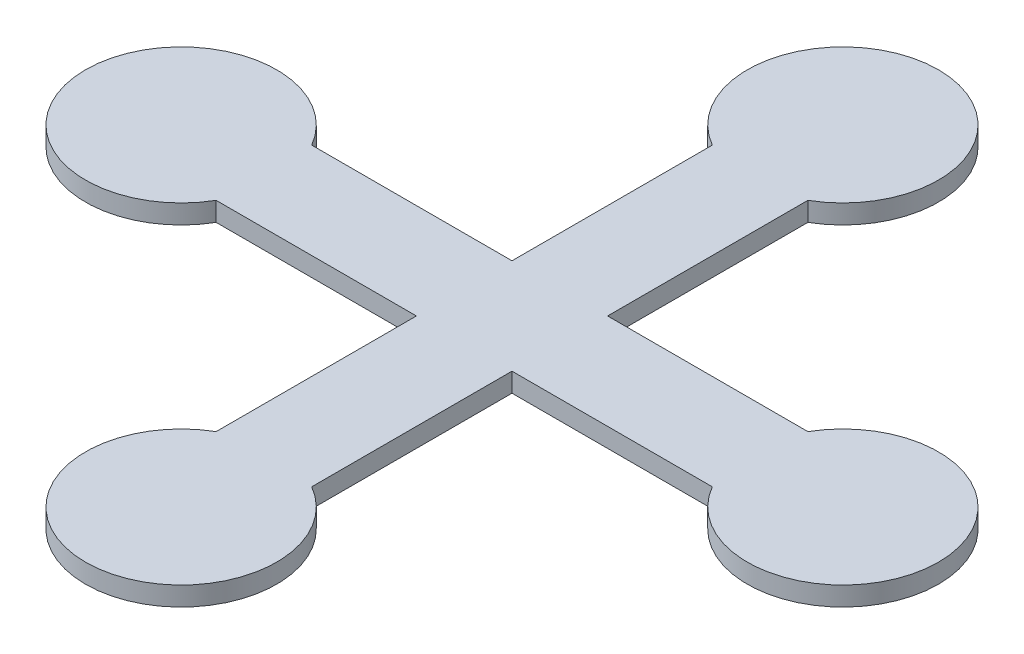
ISO-10303-21;
HEADER;
FILE_DESCRIPTION(('STEP AP214'),'2;1');
FILE_NAME('part.step','',(''),(''),'','','');
FILE_SCHEMA(('AUTOMOTIVE_DESIGN { 1 0 10303 214 1 1 1 1 }'));
ENDSEC;
DATA;
#1=APPLICATION_CONTEXT('core data for automotive mechanical design processes');
#2=APPLICATION_PROTOCOL_DEFINITION('international standard','automotive_design',2000,#1);
#3=PRODUCT_CONTEXT('',#1,'mechanical');
#4=PRODUCT('Part','Part','',(#3));
#5=PRODUCT_RELATED_PRODUCT_CATEGORY('part','',(#4));
#6=PRODUCT_DEFINITION_FORMATION('','',#4);
#7=PRODUCT_DEFINITION_CONTEXT('part definition',#1,'design');
#8=PRODUCT_DEFINITION('design','',#6,#7);
#9=PRODUCT_DEFINITION_SHAPE('','',#8);
#10=(LENGTH_UNIT() NAMED_UNIT(*) SI_UNIT(.MILLI.,.METRE.));
#11=(NAMED_UNIT(*) PLANE_ANGLE_UNIT() SI_UNIT($,.RADIAN.));
#12=(NAMED_UNIT(*) SI_UNIT($,.STERADIAN.) SOLID_ANGLE_UNIT());
#13=UNCERTAINTY_MEASURE_WITH_UNIT(LENGTH_MEASURE(1.E-05),#10,'distance_accuracy_value','');
#14=(GEOMETRIC_REPRESENTATION_CONTEXT(3) GLOBAL_UNCERTAINTY_ASSIGNED_CONTEXT((#13)) GLOBAL_UNIT_ASSIGNED_CONTEXT((#10,
#11,#12)) REPRESENTATION_CONTEXT('',''));
#15=CARTESIAN_POINT('',(0.,0.,0.));
#16=DIRECTION('',(0.,0.,1.));
#17=DIRECTION('',(1.,0.,0.));
#18=AXIS2_PLACEMENT_3D('',#15,#16,#17);
#19=CARTESIAN_POINT('',(0.124999999999999,0.05,0.125));
#20=DIRECTION('',(-1.,0.,0.));
#21=DIRECTION('',(0.,0.,1.));
#22=AXIS2_PLACEMENT_3D('',#19,#20,#21);
#23=PLANE('',#22);
#24=DIRECTION('',(0.,0.,-1.));
#25=VECTOR('',#24,1.);
#26=CARTESIAN_POINT('',(0.124999999999999,0.,0.125));
#27=LINE('',#26,#25);
#28=CARTESIAN_POINT('',(0.124999999999995,0.,0.648770499799574));
#29=VERTEX_POINT('',#28);
#30=CARTESIAN_POINT('',(0.124999999999999,0.,0.125));
#31=VERTEX_POINT('',#30);
#32=EDGE_CURVE('E164',#29,#31,#27,.T.);
#33=ORIENTED_EDGE('',*,*,#32,.T.);
#34=DIRECTION('',(0.,-1.,0.));
#35=VECTOR('',#34,1.);
#36=CARTESIAN_POINT('',(0.124999999999999,0.05,0.125));
#37=LINE('',#36,#35);
#38=CARTESIAN_POINT('',(0.124999999999999,0.05,0.125));
#39=VERTEX_POINT('',#38);
#40=EDGE_CURVE('E11',#39,#31,#37,.T.);
#41=ORIENTED_EDGE('',*,*,#40,.F.);
#42=DIRECTION('',(0.,0.,-1.));
#43=VECTOR('',#42,1.);
#44=CARTESIAN_POINT('',(0.124999999999999,0.05,0.125));
#45=LINE('',#44,#43);
#46=CARTESIAN_POINT('',(0.124999999999995,0.05,0.648770499799574));
#47=VERTEX_POINT('',#46);
#48=EDGE_CURVE('E198',#47,#39,#45,.T.);
#49=ORIENTED_EDGE('',*,*,#48,.F.);
#50=DIRECTION('',(0.,-1.,0.));
#51=VECTOR('',#50,1.);
#52=CARTESIAN_POINT('',(0.124999999999995,0.05,0.648770499799574));
#53=LINE('',#52,#51);
#54=EDGE_CURVE('E160',#47,#29,#53,.T.);
#55=ORIENTED_EDGE('',*,*,#54,.T.);
#56=EDGE_LOOP('',(#33,#41,#49,#55));
#57=FACE_BOUND('',#56,.T.);
#58=ADVANCED_FACE('F39',(#57),#23,.F.);
#59=CARTESIAN_POINT('',(0.124999999999999,0.05,0.125));
#60=DIRECTION('',(0.,0.,-1.));
#61=DIRECTION('',(-1.,0.,0.));
#62=AXIS2_PLACEMENT_3D('',#59,#60,#61);
#63=PLANE('',#62);
#64=DIRECTION('',(1.,0.,0.));
#65=VECTOR('',#64,1.);
#66=CARTESIAN_POINT('',(0.124999999999999,0.,0.125));
#67=LINE('',#66,#65);
#68=CARTESIAN_POINT('',(0.648770499799573,0.,0.125000000000002));
#69=VERTEX_POINT('',#68);
#70=EDGE_CURVE('E168',#31,#69,#67,.T.);
#71=ORIENTED_EDGE('',*,*,#70,.T.);
#72=DIRECTION('',(0.,-1.,0.));
#73=VECTOR('',#72,1.);
#74=CARTESIAN_POINT('',(0.648770499799573,0.05,0.125000000000002));
#75=LINE('',#74,#73);
#76=CARTESIAN_POINT('',(0.648770499799573,0.05,0.125000000000002));
#77=VERTEX_POINT('',#76);
#78=EDGE_CURVE('E48',#77,#69,#75,.T.);
#79=ORIENTED_EDGE('',*,*,#78,.F.);
#80=DIRECTION('',(1.,0.,0.));
#81=VECTOR('',#80,1.);
#82=CARTESIAN_POINT('',(0.124999999999999,0.05,0.125));
#83=LINE('',#82,#81);
#84=EDGE_CURVE('E111',#39,#77,#83,.T.);
#85=ORIENTED_EDGE('',*,*,#84,.F.);
#86=ORIENTED_EDGE('',*,*,#40,.T.);
#87=EDGE_LOOP('',(#71,#79,#85,#86));
#88=FACE_BOUND('',#87,.T.);
#89=ADVANCED_FACE('F292',(#88),#63,.F.);
#90=CARTESIAN_POINT('',(0.865276850745683,0.05,0.));
#91=DIRECTION('',(0.,-1.,0.));
#92=DIRECTION('',(0.,0.,-1.));
#93=AXIS2_PLACEMENT_3D('',#90,#91,#92);
#94=CYLINDRICAL_SURFACE('',#93,0.25);
#95=CARTESIAN_POINT('',(0.865276850745683,0.,0.));
#96=DIRECTION('',(0.,1.,0.));
#97=DIRECTION('',(0.,0.,1.));
#98=AXIS2_PLACEMENT_3D('',#95,#96,#97);
#99=CIRCLE('',#98,0.25);
#100=CARTESIAN_POINT('',(0.648770499799574,0.,-0.124999999999998));
#101=VERTEX_POINT('',#100);
#102=EDGE_CURVE('E171',#69,#101,#99,.T.);
#103=ORIENTED_EDGE('',*,*,#102,.T.);
#104=DIRECTION('',(0.,-1.,0.));
#105=VECTOR('',#104,1.);
#106=CARTESIAN_POINT('',(0.648770499799574,0.05,-0.124999999999998));
#107=LINE('',#106,#105);
#108=CARTESIAN_POINT('',(0.648770499799574,0.05,-0.124999999999998));
#109=VERTEX_POINT('',#108);
#110=EDGE_CURVE('E225',#109,#101,#107,.T.);
#111=ORIENTED_EDGE('',*,*,#110,.F.);
#112=CARTESIAN_POINT('',(0.865276850745683,0.05,0.));
#113=DIRECTION('',(0.,1.,0.));
#114=DIRECTION('',(0.,0.,1.));
#115=AXIS2_PLACEMENT_3D('',#112,#113,#114);
#116=CIRCLE('',#115,0.25);
#117=EDGE_CURVE('E235',#77,#109,#116,.T.);
#118=ORIENTED_EDGE('',*,*,#117,.F.);
#119=ORIENTED_EDGE('',*,*,#78,.T.);
#120=EDGE_LOOP('',(#103,#111,#118,#119));
#121=FACE_BOUND('',#120,.T.);
#122=ADVANCED_FACE('F233',(#121),#94,.T.);
#123=CARTESIAN_POINT('',(0.125,0.05,-0.124999999999999));
#124=DIRECTION('',(0.,0.,1.));
#125=DIRECTION('',(1.,0.,0.));
#126=AXIS2_PLACEMENT_3D('',#123,#124,#125);
#127=PLANE('',#126);
#128=DIRECTION('',(-1.,0.,0.));
#129=VECTOR('',#128,1.);
#130=CARTESIAN_POINT('',(0.125,0.,-0.124999999999999));
#131=LINE('',#130,#129);
#132=CARTESIAN_POINT('',(0.125,0.,-0.124999999999999));
#133=VERTEX_POINT('',#132);
#134=EDGE_CURVE('E174',#101,#133,#131,.T.);
#135=ORIENTED_EDGE('',*,*,#134,.T.);
#136=DIRECTION('',(0.,-1.,0.));
#137=VECTOR('',#136,1.);
#138=CARTESIAN_POINT('',(0.125,0.05,-0.124999999999999));
#139=LINE('',#138,#137);
#140=CARTESIAN_POINT('',(0.125,0.05,-0.124999999999999));
#141=VERTEX_POINT('',#140);
#142=EDGE_CURVE('E221',#141,#133,#139,.T.);
#143=ORIENTED_EDGE('',*,*,#142,.F.);
#144=DIRECTION('',(-1.,0.,0.));
#145=VECTOR('',#144,1.);
#146=CARTESIAN_POINT('',(0.125,0.05,-0.124999999999999));
#147=LINE('',#146,#145);
#148=EDGE_CURVE('E254',#109,#141,#147,.T.);
#149=ORIENTED_EDGE('',*,*,#148,.F.);
#150=ORIENTED_EDGE('',*,*,#110,.T.);
#151=EDGE_LOOP('',(#135,#143,#149,#150));
#152=FACE_BOUND('',#151,.T.);
#153=ADVANCED_FACE('F244',(#152),#127,.F.);
#154=CARTESIAN_POINT('',(0.125,0.05,-0.124999999999999));
#155=DIRECTION('',(-1.,0.,0.));
#156=DIRECTION('',(0.,0.,1.));
#157=AXIS2_PLACEMENT_3D('',#154,#155,#156);
#158=PLANE('',#157);
#159=DIRECTION('',(0.,0.,-1.));
#160=VECTOR('',#159,1.);
#161=CARTESIAN_POINT('',(0.125,0.,-0.124999999999999));
#162=LINE('',#161,#160);
#163=CARTESIAN_POINT('',(0.125,0.,-0.648770499799574));
#164=VERTEX_POINT('',#163);
#165=EDGE_CURVE('E177',#133,#164,#162,.T.);
#166=ORIENTED_EDGE('',*,*,#165,.T.);
#167=DIRECTION('',(0.,-1.,0.));
#168=VECTOR('',#167,1.);
#169=CARTESIAN_POINT('',(0.125,0.05,-0.648770499799574));
#170=LINE('',#169,#168);
#171=CARTESIAN_POINT('',(0.125,0.05,-0.648770499799574));
#172=VERTEX_POINT('',#171);
#173=EDGE_CURVE('E217',#172,#164,#170,.T.);
#174=ORIENTED_EDGE('',*,*,#173,.F.);
#175=DIRECTION('',(0.,0.,-1.));
#176=VECTOR('',#175,1.);
#177=CARTESIAN_POINT('',(0.125,0.05,-0.124999999999999));
#178=LINE('',#177,#176);
#179=EDGE_CURVE('E250',#141,#172,#178,.T.);
#180=ORIENTED_EDGE('',*,*,#179,.F.);
#181=ORIENTED_EDGE('',*,*,#142,.T.);
#182=EDGE_LOOP('',(#166,#174,#180,#181));
#183=FACE_BOUND('',#182,.T.);
#184=ADVANCED_FACE('F248',(#183),#158,.F.);
#185=CARTESIAN_POINT('',(0.,0.05,-0.865276850745683));
#186=DIRECTION('',(0.,-1.,0.));
#187=DIRECTION('',(0.,0.,-1.));
#188=AXIS2_PLACEMENT_3D('',#185,#186,#187);
#189=CYLINDRICAL_SURFACE('',#188,0.25);
#190=CARTESIAN_POINT('',(0.,0.,-0.865276850745683));
#191=DIRECTION('',(0.,1.,0.));
#192=DIRECTION('',(0.,0.,1.));
#193=AXIS2_PLACEMENT_3D('',#190,#191,#192);
#194=CIRCLE('',#193,0.25);
#195=CARTESIAN_POINT('',(-0.125,0.,-0.648770499799574));
#196=VERTEX_POINT('',#195);
#197=EDGE_CURVE('E180',#164,#196,#194,.T.);
#198=ORIENTED_EDGE('',*,*,#197,.T.);
#199=DIRECTION('',(0.,-1.,0.));
#200=VECTOR('',#199,1.);
#201=CARTESIAN_POINT('',(-0.125,0.05,-0.648770499799574));
#202=LINE('',#201,#200);
#203=CARTESIAN_POINT('',(-0.125,0.05,-0.648770499799574));
#204=VERTEX_POINT('',#203);
#205=EDGE_CURVE('E213',#204,#196,#202,.T.);
#206=ORIENTED_EDGE('',*,*,#205,.F.);
#207=CARTESIAN_POINT('',(0.,0.05,-0.865276850745683));
#208=DIRECTION('',(0.,1.,0.));
#209=DIRECTION('',(0.,0.,1.));
#210=AXIS2_PLACEMENT_3D('',#207,#208,#209);
#211=CIRCLE('',#210,0.25);
#212=EDGE_CURVE('E253',#172,#204,#211,.T.);
#213=ORIENTED_EDGE('',*,*,#212,.F.);
#214=ORIENTED_EDGE('',*,*,#173,.T.);
#215=EDGE_LOOP('',(#198,#206,#213,#214));
#216=FACE_BOUND('',#215,.T.);
#217=ADVANCED_FACE('F305',(#216),#189,.T.);
#218=CARTESIAN_POINT('',(-0.125,0.05,-0.125000000000001));
#219=DIRECTION('',(1.,0.,0.));
#220=DIRECTION('',(0.,0.,-1.));
#221=AXIS2_PLACEMENT_3D('',#218,#219,#220);
#222=PLANE('',#221);
#223=DIRECTION('',(0.,0.,1.));
#224=VECTOR('',#223,1.);
#225=CARTESIAN_POINT('',(-0.125,0.,-0.125000000000001));
#226=LINE('',#225,#224);
#227=CARTESIAN_POINT('',(-0.125,0.,-0.125000000000001));
#228=VERTEX_POINT('',#227);
#229=EDGE_CURVE('E183',#196,#228,#226,.T.);
#230=ORIENTED_EDGE('',*,*,#229,.T.);
#231=DIRECTION('',(0.,-1.,0.));
#232=VECTOR('',#231,1.);
#233=CARTESIAN_POINT('',(-0.125,0.05,-0.125000000000001));
#234=LINE('',#233,#232);
#235=CARTESIAN_POINT('',(-0.125,0.05,-0.125000000000001));
#236=VERTEX_POINT('',#235);
#237=EDGE_CURVE('E209',#236,#228,#234,.T.);
#238=ORIENTED_EDGE('',*,*,#237,.F.);
#239=DIRECTION('',(0.,0.,1.));
#240=VECTOR('',#239,1.);
#241=CARTESIAN_POINT('',(-0.125,0.05,-0.125000000000001));
#242=LINE('',#241,#240);
#243=EDGE_CURVE('E258',#204,#236,#242,.T.);
#244=ORIENTED_EDGE('',*,*,#243,.F.);
#245=ORIENTED_EDGE('',*,*,#205,.T.);
#246=EDGE_LOOP('',(#230,#238,#244,#245));
#247=FACE_BOUND('',#246,.T.);
#248=ADVANCED_FACE('F308',(#247),#222,.F.);
#249=CARTESIAN_POINT('',(-0.125,0.05,-0.125000000000001));
#250=DIRECTION('',(0.,0.,1.));
#251=DIRECTION('',(1.,0.,0.));
#252=AXIS2_PLACEMENT_3D('',#249,#250,#251);
#253=PLANE('',#252);
#254=DIRECTION('',(-1.,0.,0.));
#255=VECTOR('',#254,1.);
#256=CARTESIAN_POINT('',(-0.125,0.,-0.125000000000001));
#257=LINE('',#256,#255);
#258=CARTESIAN_POINT('',(-0.648770499799572,0.,-0.125000000000007));
#259=VERTEX_POINT('',#258);
#260=EDGE_CURVE('E186',#228,#259,#257,.T.);
#261=ORIENTED_EDGE('',*,*,#260,.T.);
#262=DIRECTION('',(0.,-1.,0.));
#263=VECTOR('',#262,1.);
#264=CARTESIAN_POINT('',(-0.648770499799572,0.05,-0.125000000000007));
#265=LINE('',#264,#263);
#266=CARTESIAN_POINT('',(-0.648770499799572,0.05,-0.125000000000007));
#267=VERTEX_POINT('',#266);
#268=EDGE_CURVE('E205',#267,#259,#265,.T.);
#269=ORIENTED_EDGE('',*,*,#268,.F.);
#270=DIRECTION('',(-1.,0.,0.));
#271=VECTOR('',#270,1.);
#272=CARTESIAN_POINT('',(-0.125,0.05,-0.125000000000001));
#273=LINE('',#272,#271);
#274=EDGE_CURVE('E265',#236,#267,#273,.T.);
#275=ORIENTED_EDGE('',*,*,#274,.F.);
#276=ORIENTED_EDGE('',*,*,#237,.T.);
#277=EDGE_LOOP('',(#261,#269,#275,#276));
#278=FACE_BOUND('',#277,.T.);
#279=ADVANCED_FACE('F273',(#278),#253,.F.);
#280=CARTESIAN_POINT('',(-0.865276850745683,0.05,0.));
#281=DIRECTION('',(0.,-1.,0.));
#282=DIRECTION('',(0.,0.,-1.));
#283=AXIS2_PLACEMENT_3D('',#280,#281,#282);
#284=CYLINDRICAL_SURFACE('',#283,0.25);
#285=CARTESIAN_POINT('',(-0.865276850745683,0.,0.));
#286=DIRECTION('',(0.,1.,0.));
#287=DIRECTION('',(0.,0.,1.));
#288=AXIS2_PLACEMENT_3D('',#285,#286,#287);
#289=CIRCLE('',#288,0.25);
#290=CARTESIAN_POINT('',(-0.648770499799575,0.,0.124999999999993));
#291=VERTEX_POINT('',#290);
#292=EDGE_CURVE('E189',#259,#291,#289,.T.);
#293=ORIENTED_EDGE('',*,*,#292,.T.);
#294=DIRECTION('',(0.,-1.,0.));
#295=VECTOR('',#294,1.);
#296=CARTESIAN_POINT('',(-0.648770499799575,0.05,0.124999999999993));
#297=LINE('',#296,#295);
#298=CARTESIAN_POINT('',(-0.648770499799575,0.05,0.124999999999993));
#299=VERTEX_POINT('',#298);
#300=EDGE_CURVE('E153',#299,#291,#297,.T.);
#301=ORIENTED_EDGE('',*,*,#300,.F.);
#302=CARTESIAN_POINT('',(-0.865276850745683,0.05,0.));
#303=DIRECTION('',(0.,1.,0.));
#304=DIRECTION('',(0.,0.,1.));
#305=AXIS2_PLACEMENT_3D('',#302,#303,#304);
#306=CIRCLE('',#305,0.25);
#307=EDGE_CURVE('E142',#267,#299,#306,.T.);
#308=ORIENTED_EDGE('',*,*,#307,.F.);
#309=ORIENTED_EDGE('',*,*,#268,.T.);
#310=EDGE_LOOP('',(#293,#301,#308,#309));
#311=FACE_BOUND('',#310,.T.);
#312=ADVANCED_FACE('F277',(#311),#284,.T.);
#313=CARTESIAN_POINT('',(-0.125000000000001,0.05,0.124999999999999));
#314=DIRECTION('',(0.,0.,-1.));
#315=DIRECTION('',(-1.,0.,0.));
#316=AXIS2_PLACEMENT_3D('',#313,#314,#315);
#317=PLANE('',#316);
#318=DIRECTION('',(1.,0.,0.));
#319=VECTOR('',#318,1.);
#320=CARTESIAN_POINT('',(-0.125000000000001,0.,0.124999999999999));
#321=LINE('',#320,#319);
#322=CARTESIAN_POINT('',(-0.125000000000001,0.,0.124999999999999));
#323=VERTEX_POINT('',#322);
#324=EDGE_CURVE('E151',#291,#323,#321,.T.);
#325=ORIENTED_EDGE('',*,*,#324,.T.);
#326=DIRECTION('',(0.,-1.,0.));
#327=VECTOR('',#326,1.);
#328=CARTESIAN_POINT('',(-0.125000000000001,0.05,0.124999999999999));
#329=LINE('',#328,#327);
#330=CARTESIAN_POINT('',(-0.125000000000001,0.05,0.124999999999999));
#331=VERTEX_POINT('',#330);
#332=EDGE_CURVE('E148',#331,#323,#329,.T.);
#333=ORIENTED_EDGE('',*,*,#332,.F.);
#334=DIRECTION('',(1.,0.,0.));
#335=VECTOR('',#334,1.);
#336=CARTESIAN_POINT('',(-0.125000000000001,0.05,0.124999999999999));
#337=LINE('',#336,#335);
#338=EDGE_CURVE('E136',#299,#331,#337,.T.);
#339=ORIENTED_EDGE('',*,*,#338,.F.);
#340=ORIENTED_EDGE('',*,*,#300,.T.);
#341=EDGE_LOOP('',(#325,#333,#339,#340));
#342=FACE_BOUND('',#341,.T.);
#343=ADVANCED_FACE('F149',(#342),#317,.F.);
#344=CARTESIAN_POINT('',(-0.125000000000001,0.05,0.124999999999999));
#345=DIRECTION('',(1.,0.,0.));
#346=DIRECTION('',(0.,0.,-1.));
#347=AXIS2_PLACEMENT_3D('',#344,#345,#346);
#348=PLANE('',#347);
#349=DIRECTION('',(0.,0.,1.));
#350=VECTOR('',#349,1.);
#351=CARTESIAN_POINT('',(-0.125000000000001,0.,0.124999999999999));
#352=LINE('',#351,#350);
#353=CARTESIAN_POINT('',(-0.125000000000004,0.,0.648770499799573));
#354=VERTEX_POINT('',#353);
#355=EDGE_CURVE('E97',#323,#354,#352,.T.);
#356=ORIENTED_EDGE('',*,*,#355,.T.);
#357=DIRECTION('',(0.,-1.,0.));
#358=VECTOR('',#357,1.);
#359=CARTESIAN_POINT('',(-0.125000000000004,0.05,0.648770499799573));
#360=LINE('',#359,#358);
#361=CARTESIAN_POINT('',(-0.125000000000004,0.05,0.648770499799573));
#362=VERTEX_POINT('',#361);
#363=EDGE_CURVE('E154',#362,#354,#360,.T.);
#364=ORIENTED_EDGE('',*,*,#363,.F.);
#365=DIRECTION('',(0.,0.,1.));
#366=VECTOR('',#365,1.);
#367=CARTESIAN_POINT('',(-0.125000000000001,0.05,0.124999999999999));
#368=LINE('',#367,#366);
#369=EDGE_CURVE('E140',#331,#362,#368,.T.);
#370=ORIENTED_EDGE('',*,*,#369,.F.);
#371=ORIENTED_EDGE('',*,*,#332,.T.);
#372=EDGE_LOOP('',(#356,#364,#370,#371));
#373=FACE_BOUND('',#372,.T.);
#374=ADVANCED_FACE('F156',(#373),#348,.F.);
#375=CARTESIAN_POINT('',(0.,0.05,0.865276850745683));
#376=DIRECTION('',(0.,-1.,0.));
#377=DIRECTION('',(0.,0.,-1.));
#378=AXIS2_PLACEMENT_3D('',#375,#376,#377);
#379=CYLINDRICAL_SURFACE('',#378,0.25);
#380=CARTESIAN_POINT('',(0.,0.,0.865276850745683));
#381=DIRECTION('',(0.,1.,0.));
#382=DIRECTION('',(0.,0.,1.));
#383=AXIS2_PLACEMENT_3D('',#380,#381,#382);
#384=CIRCLE('',#383,0.25);
#385=EDGE_CURVE('E103',#354,#29,#384,.T.);
#386=ORIENTED_EDGE('',*,*,#385,.T.);
#387=ORIENTED_EDGE('',*,*,#54,.F.);
#388=CARTESIAN_POINT('',(0.,0.05,0.865276850745683));
#389=DIRECTION('',(0.,1.,0.));
#390=DIRECTION('',(0.,0.,1.));
#391=AXIS2_PLACEMENT_3D('',#388,#389,#390);
#392=CIRCLE('',#391,0.25);
#393=EDGE_CURVE('E56',#362,#47,#392,.T.);
#394=ORIENTED_EDGE('',*,*,#393,.F.);
#395=ORIENTED_EDGE('',*,*,#363,.T.);
#396=EDGE_LOOP('',(#386,#387,#394,#395));
#397=FACE_BOUND('',#396,.T.);
#398=ADVANCED_FACE('F281',(#397),#379,.T.);
#399=CARTESIAN_POINT('',(0.,0.05,0.865276850745683));
#400=DIRECTION('',(0.,1.,0.));
#401=DIRECTION('',(0.,0.,1.));
#402=AXIS2_PLACEMENT_3D('',#399,#400,#401);
#403=PLANE('',#402);
#404=ORIENTED_EDGE('',*,*,#48,.T.);
#405=ORIENTED_EDGE('',*,*,#84,.T.);
#406=ORIENTED_EDGE('',*,*,#117,.T.);
#407=ORIENTED_EDGE('',*,*,#148,.T.);
#408=ORIENTED_EDGE('',*,*,#179,.T.);
#409=ORIENTED_EDGE('',*,*,#212,.T.);
#410=ORIENTED_EDGE('',*,*,#243,.T.);
#411=ORIENTED_EDGE('',*,*,#274,.T.);
#412=ORIENTED_EDGE('',*,*,#307,.T.);
#413=ORIENTED_EDGE('',*,*,#338,.T.);
#414=ORIENTED_EDGE('',*,*,#369,.T.);
#415=ORIENTED_EDGE('',*,*,#393,.T.);
#416=EDGE_LOOP('',(#404,#405,#406,#407,#408,#409,#410,#411,#412,#413,#414,#415));
#417=FACE_BOUND('',#416,.T.);
#418=ADVANCED_FACE('F138',(#417),#403,.T.);
#419=CARTESIAN_POINT('',(0.,0.,0.865276850745683));
#420=DIRECTION('',(0.,1.,0.));
#421=DIRECTION('',(0.,0.,1.));
#422=AXIS2_PLACEMENT_3D('',#419,#420,#421);
#423=PLANE('',#422);
#424=ORIENTED_EDGE('',*,*,#32,.F.);
#425=ORIENTED_EDGE('',*,*,#385,.F.);
#426=ORIENTED_EDGE('',*,*,#355,.F.);
#427=ORIENTED_EDGE('',*,*,#324,.F.);
#428=ORIENTED_EDGE('',*,*,#292,.F.);
#429=ORIENTED_EDGE('',*,*,#260,.F.);
#430=ORIENTED_EDGE('',*,*,#229,.F.);
#431=ORIENTED_EDGE('',*,*,#197,.F.);
#432=ORIENTED_EDGE('',*,*,#165,.F.);
#433=ORIENTED_EDGE('',*,*,#134,.F.);
#434=ORIENTED_EDGE('',*,*,#102,.F.);
#435=ORIENTED_EDGE('',*,*,#70,.F.);
#436=EDGE_LOOP('',(#424,#425,#426,#427,#428,#429,#430,#431,#432,#433,#434,#435));
#437=FACE_BOUND('',#436,.T.);
#438=ADVANCED_FACE('F239',(#437),#423,.F.);
#439=CLOSED_SHELL('',(#58,#89,#122,#153,#184,#217,#248,#279,#312,#343,#374,#398,#418,#438));
#440=MANIFOLD_SOLID_BREP('B2',#439);
#441=ADVANCED_BREP_SHAPE_REPRESENTATION('',(#18,#440),#14);
#442=SHAPE_DEFINITION_REPRESENTATION(#9,#441);
ENDSEC;
END-ISO-10303-21;
